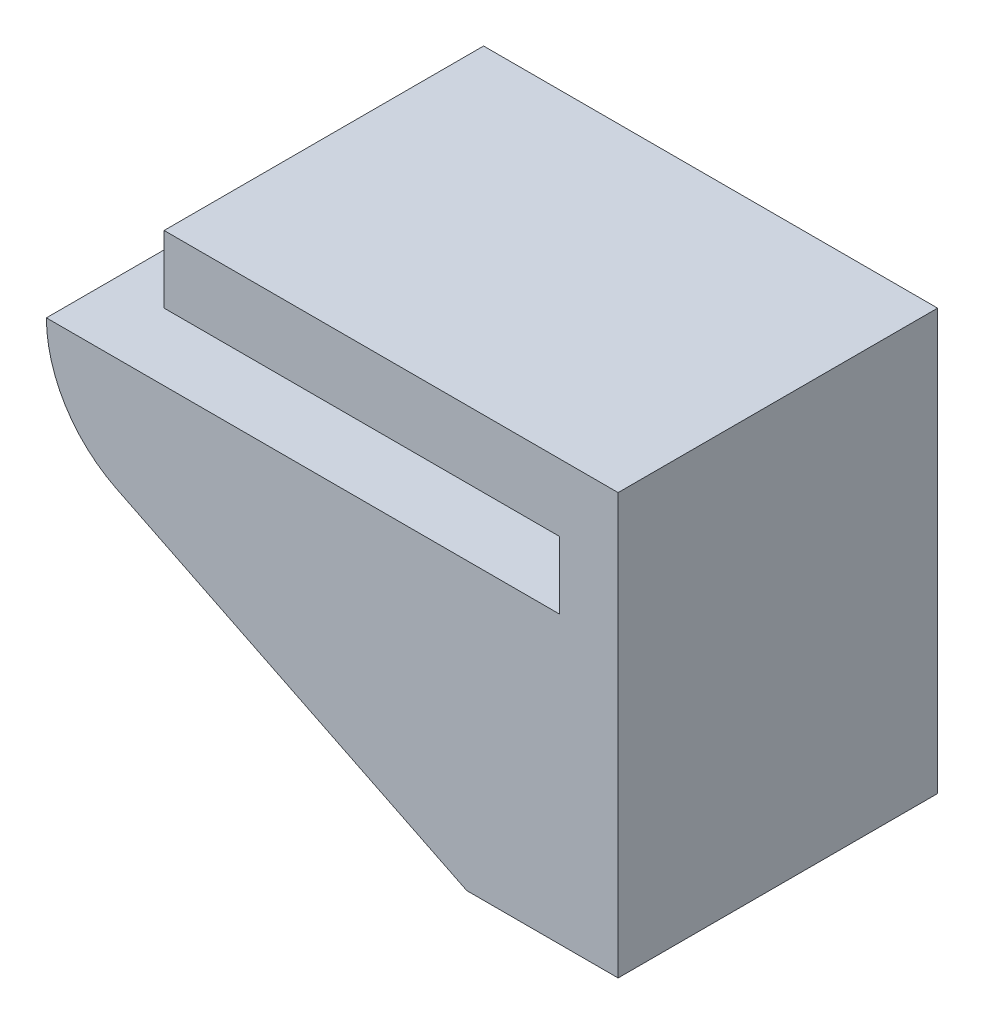
ISO-10303-21;
HEADER;
FILE_DESCRIPTION(('STEP AP214'),'2;1');
FILE_NAME('part.step','',(''),(''),'','','');
FILE_SCHEMA(('AUTOMOTIVE_DESIGN { 1 0 10303 214 1 1 1 1 }'));
ENDSEC;
DATA;
#1=APPLICATION_CONTEXT('core data for automotive mechanical design processes');
#2=APPLICATION_PROTOCOL_DEFINITION('international standard','automotive_design',2000,#1);
#3=PRODUCT_CONTEXT('',#1,'mechanical');
#4=PRODUCT('Part','Part','',(#3));
#5=PRODUCT_RELATED_PRODUCT_CATEGORY('part','',(#4));
#6=PRODUCT_DEFINITION_FORMATION('','',#4);
#7=PRODUCT_DEFINITION_CONTEXT('part definition',#1,'design');
#8=PRODUCT_DEFINITION('design','',#6,#7);
#9=PRODUCT_DEFINITION_SHAPE('','',#8);
#10=(LENGTH_UNIT() NAMED_UNIT(*) SI_UNIT(.MILLI.,.METRE.));
#11=(NAMED_UNIT(*) PLANE_ANGLE_UNIT() SI_UNIT($,.RADIAN.));
#12=(NAMED_UNIT(*) SI_UNIT($,.STERADIAN.) SOLID_ANGLE_UNIT());
#13=UNCERTAINTY_MEASURE_WITH_UNIT(LENGTH_MEASURE(1.E-05),#10,'distance_accuracy_value','');
#14=(GEOMETRIC_REPRESENTATION_CONTEXT(3) GLOBAL_UNCERTAINTY_ASSIGNED_CONTEXT((#13)) GLOBAL_UNIT_ASSIGNED_CONTEXT((#10,
#11,#12)) REPRESENTATION_CONTEXT('',''));
#15=CARTESIAN_POINT('',(0.,0.,0.));
#16=DIRECTION('',(0.,0.,1.));
#17=DIRECTION('',(1.,0.,0.));
#18=AXIS2_PLACEMENT_3D('',#15,#16,#17);
#19=CARTESIAN_POINT('',(-27.,8.,19.));
#20=DIRECTION('',(0.,-1.,0.));
#21=DIRECTION('',(1.,0.,0.));
#22=AXIS2_PLACEMENT_3D('',#19,#20,#21);
#23=PLANE('',#22);
#24=DIRECTION('',(-1.,0.,0.));
#25=VECTOR('',#24,1.);
#26=CARTESIAN_POINT('',(-27.,8.,0.));
#27=LINE('',#26,#25);
#28=CARTESIAN_POINT('',(0.,8.,0.));
#29=VERTEX_POINT('',#28);
#30=CARTESIAN_POINT('',(-27.,8.,0.));
#31=VERTEX_POINT('',#30);
#32=EDGE_CURVE('E146',#29,#31,#27,.T.);
#33=ORIENTED_EDGE('',*,*,#32,.T.);
#34=DIRECTION('',(0.,0.,-1.));
#35=VECTOR('',#34,1.);
#36=CARTESIAN_POINT('',(-27.,8.,19.));
#37=LINE('',#36,#35);
#38=CARTESIAN_POINT('',(-27.,8.,19.));
#39=VERTEX_POINT('',#38);
#40=EDGE_CURVE('E11',#39,#31,#37,.T.);
#41=ORIENTED_EDGE('',*,*,#40,.F.);
#42=DIRECTION('',(-1.,0.,0.));
#43=VECTOR('',#42,1.);
#44=CARTESIAN_POINT('',(-27.,8.,19.));
#45=LINE('',#44,#43);
#46=CARTESIAN_POINT('',(0.,8.,19.));
#47=VERTEX_POINT('',#46);
#48=EDGE_CURVE('E171',#47,#39,#45,.T.);
#49=ORIENTED_EDGE('',*,*,#48,.F.);
#50=DIRECTION('',(0.,0.,-1.));
#51=VECTOR('',#50,1.);
#52=CARTESIAN_POINT('',(0.,8.,19.));
#53=LINE('',#52,#51);
#54=EDGE_CURVE('E142',#47,#29,#53,.T.);
#55=ORIENTED_EDGE('',*,*,#54,.T.);
#56=EDGE_LOOP('',(#33,#41,#49,#55));
#57=FACE_BOUND('',#56,.T.);
#58=ADVANCED_FACE('F39',(#57),#23,.F.);
#59=CARTESIAN_POINT('',(-27.,4.,19.));
#60=DIRECTION('',(1.,0.,0.));
#61=DIRECTION('',(0.,0.,-1.));
#62=AXIS2_PLACEMENT_3D('',#59,#60,#61);
#63=PLANE('',#62);
#64=DIRECTION('',(0.,-1.,0.));
#65=VECTOR('',#64,1.);
#66=CARTESIAN_POINT('',(-27.,4.,0.));
#67=LINE('',#66,#65);
#68=CARTESIAN_POINT('',(-27.,4.,0.));
#69=VERTEX_POINT('',#68);
#70=EDGE_CURVE('E150',#31,#69,#67,.T.);
#71=ORIENTED_EDGE('',*,*,#70,.T.);
#72=DIRECTION('',(0.,0.,-1.));
#73=VECTOR('',#72,1.);
#74=CARTESIAN_POINT('',(-27.,4.,19.));
#75=LINE('',#74,#73);
#76=CARTESIAN_POINT('',(-27.,4.,19.));
#77=VERTEX_POINT('',#76);
#78=EDGE_CURVE('E48',#77,#69,#75,.T.);
#79=ORIENTED_EDGE('',*,*,#78,.F.);
#80=DIRECTION('',(0.,-1.,0.));
#81=VECTOR('',#80,1.);
#82=CARTESIAN_POINT('',(-27.,4.,19.));
#83=LINE('',#82,#81);
#84=EDGE_CURVE('E102',#39,#77,#83,.T.);
#85=ORIENTED_EDGE('',*,*,#84,.F.);
#86=ORIENTED_EDGE('',*,*,#40,.T.);
#87=EDGE_LOOP('',(#71,#79,#85,#86));
#88=FACE_BOUND('',#87,.T.);
#89=ADVANCED_FACE('F227',(#88),#63,.F.);
#90=CARTESIAN_POINT('',(-3.5,4.,19.));
#91=DIRECTION('',(0.,1.,0.));
#92=DIRECTION('',(-1.,0.,0.));
#93=AXIS2_PLACEMENT_3D('',#90,#91,#92);
#94=PLANE('',#93);
#95=DIRECTION('',(1.,0.,0.));
#96=VECTOR('',#95,1.);
#97=CARTESIAN_POINT('',(-3.5,4.,0.));
#98=LINE('',#97,#96);
#99=CARTESIAN_POINT('',(-3.5,4.,0.));
#100=VERTEX_POINT('',#99);
#101=EDGE_CURVE('E153',#69,#100,#98,.T.);
#102=ORIENTED_EDGE('',*,*,#101,.T.);
#103=DIRECTION('',(0.,0.,-1.));
#104=VECTOR('',#103,1.);
#105=CARTESIAN_POINT('',(-3.5,4.,19.));
#106=LINE('',#105,#104);
#107=CARTESIAN_POINT('',(-3.5,4.,19.));
#108=VERTEX_POINT('',#107);
#109=EDGE_CURVE('E186',#108,#100,#106,.T.);
#110=ORIENTED_EDGE('',*,*,#109,.F.);
#111=DIRECTION('',(1.,0.,0.));
#112=VECTOR('',#111,1.);
#113=CARTESIAN_POINT('',(-3.5,4.,19.));
#114=LINE('',#113,#112);
#115=EDGE_CURVE('E196',#77,#108,#114,.T.);
#116=ORIENTED_EDGE('',*,*,#115,.F.);
#117=ORIENTED_EDGE('',*,*,#78,.T.);
#118=EDGE_LOOP('',(#102,#110,#116,#117));
#119=FACE_BOUND('',#118,.T.);
#120=ADVANCED_FACE('F194',(#119),#94,.F.);
#121=CARTESIAN_POINT('',(-3.5,0.,19.));
#122=DIRECTION('',(1.,0.,0.));
#123=DIRECTION('',(0.,0.,-1.));
#124=AXIS2_PLACEMENT_3D('',#121,#122,#123);
#125=PLANE('',#124);
#126=DIRECTION('',(0.,-1.,0.));
#127=VECTOR('',#126,1.);
#128=CARTESIAN_POINT('',(-3.5,0.,0.));
#129=LINE('',#128,#127);
#130=CARTESIAN_POINT('',(-3.5,0.,0.));
#131=VERTEX_POINT('',#130);
#132=EDGE_CURVE('E156',#100,#131,#129,.T.);
#133=ORIENTED_EDGE('',*,*,#132,.T.);
#134=DIRECTION('',(0.,0.,-1.));
#135=VECTOR('',#134,1.);
#136=CARTESIAN_POINT('',(-3.5,0.,19.));
#137=LINE('',#136,#135);
#138=CARTESIAN_POINT('',(-3.5,0.,19.));
#139=VERTEX_POINT('',#138);
#140=EDGE_CURVE('E182',#139,#131,#137,.T.);
#141=ORIENTED_EDGE('',*,*,#140,.F.);
#142=DIRECTION('',(0.,-1.,0.));
#143=VECTOR('',#142,1.);
#144=CARTESIAN_POINT('',(-3.5,0.,19.));
#145=LINE('',#144,#143);
#146=EDGE_CURVE('E213',#108,#139,#145,.T.);
#147=ORIENTED_EDGE('',*,*,#146,.F.);
#148=ORIENTED_EDGE('',*,*,#109,.T.);
#149=EDGE_LOOP('',(#133,#141,#147,#148));
#150=FACE_BOUND('',#149,.T.);
#151=ADVANCED_FACE('F205',(#150),#125,.F.);
#152=CARTESIAN_POINT('',(-34.,0.,19.));
#153=DIRECTION('',(0.,-1.,0.));
#154=DIRECTION('',(1.,0.,0.));
#155=AXIS2_PLACEMENT_3D('',#152,#153,#154);
#156=PLANE('',#155);
#157=DIRECTION('',(-1.,0.,0.));
#158=VECTOR('',#157,1.);
#159=CARTESIAN_POINT('',(-34.,0.,0.));
#160=LINE('',#159,#158);
#161=CARTESIAN_POINT('',(-34.,0.,0.));
#162=VERTEX_POINT('',#161);
#163=EDGE_CURVE('E159',#131,#162,#160,.T.);
#164=ORIENTED_EDGE('',*,*,#163,.T.);
#165=DIRECTION('',(0.,0.,-1.));
#166=VECTOR('',#165,1.);
#167=CARTESIAN_POINT('',(-34.,0.,19.));
#168=LINE('',#167,#166);
#169=CARTESIAN_POINT('',(-34.,0.,19.));
#170=VERTEX_POINT('',#169);
#171=EDGE_CURVE('E178',#170,#162,#168,.T.);
#172=ORIENTED_EDGE('',*,*,#171,.F.);
#173=DIRECTION('',(-1.,0.,0.));
#174=VECTOR('',#173,1.);
#175=CARTESIAN_POINT('',(-34.,0.,19.));
#176=LINE('',#175,#174);
#177=EDGE_CURVE('E211',#139,#170,#176,.T.);
#178=ORIENTED_EDGE('',*,*,#177,.F.);
#179=ORIENTED_EDGE('',*,*,#140,.T.);
#180=EDGE_LOOP('',(#164,#172,#178,#179));
#181=FACE_BOUND('',#180,.T.);
#182=ADVANCED_FACE('F209',(#181),#156,.F.);
#183=CARTESIAN_POINT('',(-26.5,0.,19.));
#184=DIRECTION('',(0.,0.,-1.));
#185=DIRECTION('',(-1.,0.,0.));
#186=AXIS2_PLACEMENT_3D('',#183,#184,#185);
#187=CYLINDRICAL_SURFACE('',#186,7.5);
#188=CARTESIAN_POINT('',(-26.5,0.,0.));
#189=DIRECTION('',(0.,0.,1.));
#190=DIRECTION('',(1.,0.,0.));
#191=AXIS2_PLACEMENT_3D('',#188,#189,#190);
#192=CIRCLE('',#191,7.5);
#193=CARTESIAN_POINT('',(-29.8191308280423,-6.72557585239651,0.));
#194=VERTEX_POINT('',#193);
#195=EDGE_CURVE('E162',#162,#194,#192,.T.);
#196=ORIENTED_EDGE('',*,*,#195,.T.);
#197=DIRECTION('',(0.,0.,-1.));
#198=VECTOR('',#197,1.);
#199=CARTESIAN_POINT('',(-29.8191308280423,-6.72557585239651,19.));
#200=LINE('',#199,#198);
#201=CARTESIAN_POINT('',(-29.8191308280423,-6.72557585239651,19.));
#202=VERTEX_POINT('',#201);
#203=EDGE_CURVE('E135',#202,#194,#200,.T.);
#204=ORIENTED_EDGE('',*,*,#203,.F.);
#205=CARTESIAN_POINT('',(-26.5,0.,19.));
#206=DIRECTION('',(0.,0.,1.));
#207=DIRECTION('',(1.,0.,0.));
#208=AXIS2_PLACEMENT_3D('',#205,#206,#207);
#209=CIRCLE('',#208,7.5);
#210=EDGE_CURVE('E124',#170,#202,#209,.T.);
#211=ORIENTED_EDGE('',*,*,#210,.F.);
#212=ORIENTED_EDGE('',*,*,#171,.T.);
#213=EDGE_LOOP('',(#196,#204,#211,#212));
#214=FACE_BOUND('',#213,.T.);
#215=ADVANCED_FACE('F239',(#214),#187,.T.);
#216=CARTESIAN_POINT('',(-9.,-17.,19.));
#217=DIRECTION('',(0.44255077707231,0.896743446986202,0.));
#218=DIRECTION('',(-0.896743446986202,0.44255077707231,0.));
#219=AXIS2_PLACEMENT_3D('',#216,#217,#218);
#220=PLANE('',#219);
#221=DIRECTION('',(0.896743446986202,-0.44255077707231,0.));
#222=VECTOR('',#221,1.);
#223=CARTESIAN_POINT('',(-9.,-17.,0.));
#224=LINE('',#223,#222);
#225=CARTESIAN_POINT('',(-9.,-17.,0.));
#226=VERTEX_POINT('',#225);
#227=EDGE_CURVE('E133',#194,#226,#224,.T.);
#228=ORIENTED_EDGE('',*,*,#227,.T.);
#229=DIRECTION('',(0.,0.,-1.));
#230=VECTOR('',#229,1.);
#231=CARTESIAN_POINT('',(-9.,-17.,19.));
#232=LINE('',#231,#230);
#233=CARTESIAN_POINT('',(-9.,-17.,19.));
#234=VERTEX_POINT('',#233);
#235=EDGE_CURVE('E130',#234,#226,#232,.T.);
#236=ORIENTED_EDGE('',*,*,#235,.F.);
#237=DIRECTION('',(0.896743446986202,-0.44255077707231,0.));
#238=VECTOR('',#237,1.);
#239=CARTESIAN_POINT('',(-9.,-17.,19.));
#240=LINE('',#239,#238);
#241=EDGE_CURVE('E118',#202,#234,#240,.T.);
#242=ORIENTED_EDGE('',*,*,#241,.F.);
#243=ORIENTED_EDGE('',*,*,#203,.T.);
#244=EDGE_LOOP('',(#228,#236,#242,#243));
#245=FACE_BOUND('',#244,.T.);
#246=ADVANCED_FACE('F131',(#245),#220,.F.);
#247=CARTESIAN_POINT('',(-9.,-17.,19.));
#248=DIRECTION('',(0.,1.,0.));
#249=DIRECTION('',(0.,0.,1.));
#250=AXIS2_PLACEMENT_3D('',#247,#248,#249);
#251=PLANE('',#250);
#252=DIRECTION('',(1.,0.,0.));
#253=VECTOR('',#252,1.);
#254=CARTESIAN_POINT('',(-9.,-17.,0.));
#255=LINE('',#254,#253);
#256=CARTESIAN_POINT('',(0.,-17.,0.));
#257=VERTEX_POINT('',#256);
#258=EDGE_CURVE('E88',#226,#257,#255,.T.);
#259=ORIENTED_EDGE('',*,*,#258,.T.);
#260=DIRECTION('',(0.,0.,-1.));
#261=VECTOR('',#260,1.);
#262=CARTESIAN_POINT('',(0.,-17.,19.));
#263=LINE('',#262,#261);
#264=CARTESIAN_POINT('',(0.,-17.,19.));
#265=VERTEX_POINT('',#264);
#266=EDGE_CURVE('E136',#265,#257,#263,.T.);
#267=ORIENTED_EDGE('',*,*,#266,.F.);
#268=DIRECTION('',(1.,0.,0.));
#269=VECTOR('',#268,1.);
#270=CARTESIAN_POINT('',(-9.,-17.,19.));
#271=LINE('',#270,#269);
#272=EDGE_CURVE('E122',#234,#265,#271,.T.);
#273=ORIENTED_EDGE('',*,*,#272,.F.);
#274=ORIENTED_EDGE('',*,*,#235,.T.);
#275=EDGE_LOOP('',(#259,#267,#273,#274));
#276=FACE_BOUND('',#275,.T.);
#277=ADVANCED_FACE('F138',(#276),#251,.F.);
#278=CARTESIAN_POINT('',(0.,8.,19.));
#279=DIRECTION('',(-1.,0.,0.));
#280=DIRECTION('',(0.,-1.,0.));
#281=AXIS2_PLACEMENT_3D('',#278,#279,#280);
#282=PLANE('',#281);
#283=DIRECTION('',(0.,1.,0.));
#284=VECTOR('',#283,1.);
#285=CARTESIAN_POINT('',(0.,8.,0.));
#286=LINE('',#285,#284);
#287=EDGE_CURVE('E94',#257,#29,#286,.T.);
#288=ORIENTED_EDGE('',*,*,#287,.T.);
#289=ORIENTED_EDGE('',*,*,#54,.F.);
#290=DIRECTION('',(0.,1.,0.));
#291=VECTOR('',#290,1.);
#292=CARTESIAN_POINT('',(0.,8.,19.));
#293=LINE('',#292,#291);
#294=EDGE_CURVE('E56',#265,#47,#293,.T.);
#295=ORIENTED_EDGE('',*,*,#294,.F.);
#296=ORIENTED_EDGE('',*,*,#266,.T.);
#297=EDGE_LOOP('',(#288,#289,#295,#296));
#298=FACE_BOUND('',#297,.T.);
#299=ADVANCED_FACE('F247',(#298),#282,.F.);
#300=CARTESIAN_POINT('',(-26.5,0.,19.));
#301=DIRECTION('',(0.,0.,1.));
#302=DIRECTION('',(1.,0.,0.));
#303=AXIS2_PLACEMENT_3D('',#300,#301,#302);
#304=PLANE('',#303);
#305=ORIENTED_EDGE('',*,*,#48,.T.);
#306=ORIENTED_EDGE('',*,*,#84,.T.);
#307=ORIENTED_EDGE('',*,*,#115,.T.);
#308=ORIENTED_EDGE('',*,*,#146,.T.);
#309=ORIENTED_EDGE('',*,*,#177,.T.);
#310=ORIENTED_EDGE('',*,*,#210,.T.);
#311=ORIENTED_EDGE('',*,*,#241,.T.);
#312=ORIENTED_EDGE('',*,*,#272,.T.);
#313=ORIENTED_EDGE('',*,*,#294,.T.);
#314=EDGE_LOOP('',(#305,#306,#307,#308,#309,#310,#311,#312,#313));
#315=FACE_BOUND('',#314,.T.);
#316=ADVANCED_FACE('F120',(#315),#304,.T.);
#317=CARTESIAN_POINT('',(-26.5,0.,0.));
#318=DIRECTION('',(0.,0.,1.));
#319=DIRECTION('',(1.,0.,0.));
#320=AXIS2_PLACEMENT_3D('',#317,#318,#319);
#321=PLANE('',#320);
#322=ORIENTED_EDGE('',*,*,#32,.F.);
#323=ORIENTED_EDGE('',*,*,#287,.F.);
#324=ORIENTED_EDGE('',*,*,#258,.F.);
#325=ORIENTED_EDGE('',*,*,#227,.F.);
#326=ORIENTED_EDGE('',*,*,#195,.F.);
#327=ORIENTED_EDGE('',*,*,#163,.F.);
#328=ORIENTED_EDGE('',*,*,#132,.F.);
#329=ORIENTED_EDGE('',*,*,#101,.F.);
#330=ORIENTED_EDGE('',*,*,#70,.F.);
#331=EDGE_LOOP('',(#322,#323,#324,#325,#326,#327,#328,#329,#330));
#332=FACE_BOUND('',#331,.T.);
#333=ADVANCED_FACE('F200',(#332),#321,.F.);
#334=CLOSED_SHELL('',(#58,#89,#120,#151,#182,#215,#246,#277,#299,#316,#333));
#335=MANIFOLD_SOLID_BREP('B2',#334);
#336=ADVANCED_BREP_SHAPE_REPRESENTATION('',(#18,#335),#14);
#337=SHAPE_DEFINITION_REPRESENTATION(#9,#336);
ENDSEC;
END-ISO-10303-21;
